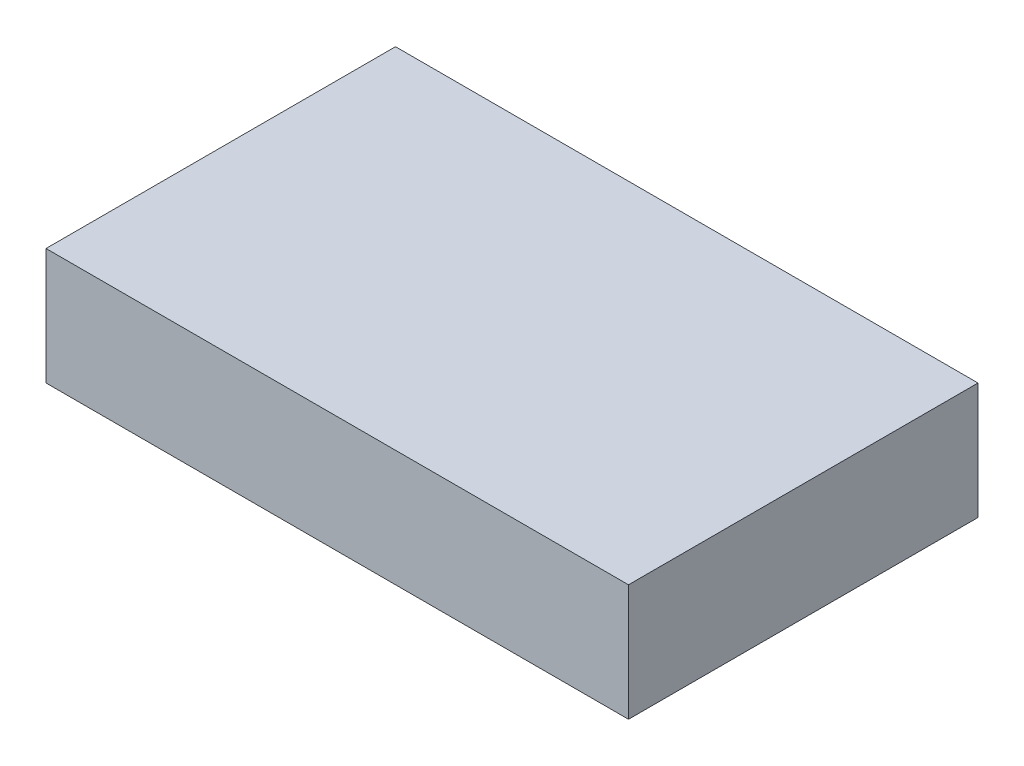
ISO-10303-21;
HEADER;
FILE_DESCRIPTION(('STEP AP214'),'2;1');
FILE_NAME('part.step','',(''),(''),'','','');
FILE_SCHEMA(('AUTOMOTIVE_DESIGN { 1 0 10303 214 1 1 1 1 }'));
ENDSEC;
DATA;
#1=APPLICATION_CONTEXT('core data for automotive mechanical design processes');
#2=APPLICATION_PROTOCOL_DEFINITION('international standard','automotive_design',2000,#1);
#3=PRODUCT_CONTEXT('',#1,'mechanical');
#4=PRODUCT('Part','Part','',(#3));
#5=PRODUCT_RELATED_PRODUCT_CATEGORY('part','',(#4));
#6=PRODUCT_DEFINITION_FORMATION('','',#4);
#7=PRODUCT_DEFINITION_CONTEXT('part definition',#1,'design');
#8=PRODUCT_DEFINITION('design','',#6,#7);
#9=PRODUCT_DEFINITION_SHAPE('','',#8);
#10=(LENGTH_UNIT() NAMED_UNIT(*) SI_UNIT(.MILLI.,.METRE.));
#11=(NAMED_UNIT(*) PLANE_ANGLE_UNIT() SI_UNIT($,.RADIAN.));
#12=(NAMED_UNIT(*) SI_UNIT($,.STERADIAN.) SOLID_ANGLE_UNIT());
#13=UNCERTAINTY_MEASURE_WITH_UNIT(LENGTH_MEASURE(1.E-05),#10,'distance_accuracy_value','');
#14=(GEOMETRIC_REPRESENTATION_CONTEXT(3) GLOBAL_UNCERTAINTY_ASSIGNED_CONTEXT((#13)) GLOBAL_UNIT_ASSIGNED_CONTEXT((#10,
#11,#12)) REPRESENTATION_CONTEXT('',''));
#15=CARTESIAN_POINT('',(0.,0.,0.));
#16=DIRECTION('',(0.,0.,1.));
#17=DIRECTION('',(1.,0.,0.));
#18=AXIS2_PLACEMENT_3D('',#15,#16,#17);
#19=CARTESIAN_POINT('',(-3276.44153160715,1000.,-1169.11764705882));
#20=DIRECTION('',(1.,0.,0.));
#21=DIRECTION('',(0.,0.,-1.));
#22=AXIS2_PLACEMENT_3D('',#19,#20,#21);
#23=PLANE('',#22);
#24=DIRECTION('',(0.,0.,1.));
#25=VECTOR('',#24,1.);
#26=CARTESIAN_POINT('',(-3276.44153160715,0.,-1169.11764705882));
#27=LINE('',#26,#25);
#28=CARTESIAN_POINT('',(-3276.44153160715,0.,-1169.11764705882));
#29=VERTEX_POINT('',#28);
#30=CARTESIAN_POINT('',(-3276.44153160715,0.,1830.88235294118));
#31=VERTEX_POINT('',#30);
#32=EDGE_CURVE('E107',#29,#31,#27,.T.);
#33=ORIENTED_EDGE('',*,*,#32,.T.);
#34=DIRECTION('',(0.,-1.,0.));
#35=VECTOR('',#34,1.);
#36=CARTESIAN_POINT('',(-3276.44153160715,1000.,1830.88235294118));
#37=LINE('',#36,#35);
#38=CARTESIAN_POINT('',(-3276.44153160715,1000.,1830.88235294118));
#39=VERTEX_POINT('',#38);
#40=EDGE_CURVE('E11',#39,#31,#37,.T.);
#41=ORIENTED_EDGE('',*,*,#40,.F.);
#42=DIRECTION('',(0.,0.,1.));
#43=VECTOR('',#42,1.);
#44=CARTESIAN_POINT('',(-3276.44153160715,1000.,-1169.11764705882));
#45=LINE('',#44,#43);
#46=CARTESIAN_POINT('',(-3276.44153160715,1000.,-1169.11764705882));
#47=VERTEX_POINT('',#46);
#48=EDGE_CURVE('E91',#47,#39,#45,.T.);
#49=ORIENTED_EDGE('',*,*,#48,.F.);
#50=DIRECTION('',(0.,-1.,0.));
#51=VECTOR('',#50,1.);
#52=CARTESIAN_POINT('',(-3276.44153160715,1000.,-1169.11764705882));
#53=LINE('',#52,#51);
#54=EDGE_CURVE('E103',#47,#29,#53,.T.);
#55=ORIENTED_EDGE('',*,*,#54,.T.);
#56=EDGE_LOOP('',(#33,#41,#49,#55));
#57=FACE_BOUND('',#56,.T.);
#58=ADVANCED_FACE('F39',(#57),#23,.F.);
#59=CARTESIAN_POINT('',(-3276.44153160715,1000.,1830.88235294118));
#60=DIRECTION('',(0.,0.,-1.));
#61=DIRECTION('',(-1.,0.,0.));
#62=AXIS2_PLACEMENT_3D('',#59,#60,#61);
#63=PLANE('',#62);
#64=DIRECTION('',(1.,0.,0.));
#65=VECTOR('',#64,1.);
#66=CARTESIAN_POINT('',(-3276.44153160715,0.,1830.88235294118));
#67=LINE('',#66,#65);
#68=CARTESIAN_POINT('',(1723.55846839285,0.,1830.88235294118));
#69=VERTEX_POINT('',#68);
#70=EDGE_CURVE('E96',#31,#69,#67,.T.);
#71=ORIENTED_EDGE('',*,*,#70,.T.);
#72=DIRECTION('',(0.,-1.,0.));
#73=VECTOR('',#72,1.);
#74=CARTESIAN_POINT('',(1723.55846839285,1000.,1830.88235294118));
#75=LINE('',#74,#73);
#76=CARTESIAN_POINT('',(1723.55846839285,1000.,1830.88235294118));
#77=VERTEX_POINT('',#76);
#78=EDGE_CURVE('E48',#77,#69,#75,.T.);
#79=ORIENTED_EDGE('',*,*,#78,.F.);
#80=DIRECTION('',(1.,0.,0.));
#81=VECTOR('',#80,1.);
#82=CARTESIAN_POINT('',(-3276.44153160715,1000.,1830.88235294118));
#83=LINE('',#82,#81);
#84=EDGE_CURVE('E86',#39,#77,#83,.T.);
#85=ORIENTED_EDGE('',*,*,#84,.F.);
#86=ORIENTED_EDGE('',*,*,#40,.T.);
#87=EDGE_LOOP('',(#71,#79,#85,#86));
#88=FACE_BOUND('',#87,.T.);
#89=ADVANCED_FACE('F95',(#88),#63,.F.);
#90=CARTESIAN_POINT('',(1723.55846839285,1000.,-1169.11764705882));
#91=DIRECTION('',(-1.,0.,0.));
#92=DIRECTION('',(0.,0.,1.));
#93=AXIS2_PLACEMENT_3D('',#90,#91,#92);
#94=PLANE('',#93);
#95=DIRECTION('',(0.,0.,-1.));
#96=VECTOR('',#95,1.);
#97=CARTESIAN_POINT('',(1723.55846839285,0.,-1169.11764705882));
#98=LINE('',#97,#96);
#99=CARTESIAN_POINT('',(1723.55846839285,0.,-1169.11764705882));
#100=VERTEX_POINT('',#99);
#101=EDGE_CURVE('E73',#69,#100,#98,.T.);
#102=ORIENTED_EDGE('',*,*,#101,.T.);
#103=DIRECTION('',(0.,-1.,0.));
#104=VECTOR('',#103,1.);
#105=CARTESIAN_POINT('',(1723.55846839285,1000.,-1169.11764705882));
#106=LINE('',#105,#104);
#107=CARTESIAN_POINT('',(1723.55846839285,1000.,-1169.11764705882));
#108=VERTEX_POINT('',#107);
#109=EDGE_CURVE('E98',#108,#100,#106,.T.);
#110=ORIENTED_EDGE('',*,*,#109,.F.);
#111=DIRECTION('',(0.,0.,-1.));
#112=VECTOR('',#111,1.);
#113=CARTESIAN_POINT('',(1723.55846839285,1000.,-1169.11764705882));
#114=LINE('',#113,#112);
#115=EDGE_CURVE('E89',#77,#108,#114,.T.);
#116=ORIENTED_EDGE('',*,*,#115,.F.);
#117=ORIENTED_EDGE('',*,*,#78,.T.);
#118=EDGE_LOOP('',(#102,#110,#116,#117));
#119=FACE_BOUND('',#118,.T.);
#120=ADVANCED_FACE('F99',(#119),#94,.F.);
#121=CARTESIAN_POINT('',(-3276.44153160715,1000.,-1169.11764705882));
#122=DIRECTION('',(0.,0.,1.));
#123=DIRECTION('',(1.,0.,0.));
#124=AXIS2_PLACEMENT_3D('',#121,#122,#123);
#125=PLANE('',#124);
#126=DIRECTION('',(-1.,0.,0.));
#127=VECTOR('',#126,1.);
#128=CARTESIAN_POINT('',(-3276.44153160715,0.,-1169.11764705882));
#129=LINE('',#128,#127);
#130=EDGE_CURVE('E79',#100,#29,#129,.T.);
#131=ORIENTED_EDGE('',*,*,#130,.T.);
#132=ORIENTED_EDGE('',*,*,#54,.F.);
#133=DIRECTION('',(-1.,0.,0.));
#134=VECTOR('',#133,1.);
#135=CARTESIAN_POINT('',(-3276.44153160715,1000.,-1169.11764705882));
#136=LINE('',#135,#134);
#137=EDGE_CURVE('E56',#108,#47,#136,.T.);
#138=ORIENTED_EDGE('',*,*,#137,.F.);
#139=ORIENTED_EDGE('',*,*,#109,.T.);
#140=EDGE_LOOP('',(#131,#132,#138,#139));
#141=FACE_BOUND('',#140,.T.);
#142=ADVANCED_FACE('F120',(#141),#125,.F.);
#143=CARTESIAN_POINT('',(0.,1000.,0.));
#144=DIRECTION('',(0.,1.,0.));
#145=DIRECTION('',(0.,0.,1.));
#146=AXIS2_PLACEMENT_3D('',#143,#144,#145);
#147=PLANE('',#146);
#148=ORIENTED_EDGE('',*,*,#48,.T.);
#149=ORIENTED_EDGE('',*,*,#84,.T.);
#150=ORIENTED_EDGE('',*,*,#115,.T.);
#151=ORIENTED_EDGE('',*,*,#137,.T.);
#152=EDGE_LOOP('',(#148,#149,#150,#151));
#153=FACE_BOUND('',#152,.T.);
#154=ADVANCED_FACE('F87',(#153),#147,.T.);
#155=CARTESIAN_POINT('',(0.,0.,0.));
#156=DIRECTION('',(0.,1.,0.));
#157=DIRECTION('',(0.,0.,1.));
#158=AXIS2_PLACEMENT_3D('',#155,#156,#157);
#159=PLANE('',#158);
#160=ORIENTED_EDGE('',*,*,#32,.F.);
#161=ORIENTED_EDGE('',*,*,#130,.F.);
#162=ORIENTED_EDGE('',*,*,#101,.F.);
#163=ORIENTED_EDGE('',*,*,#70,.F.);
#164=EDGE_LOOP('',(#160,#161,#162,#163));
#165=FACE_BOUND('',#164,.T.);
#166=ADVANCED_FACE('F123',(#165),#159,.F.);
#167=CLOSED_SHELL('',(#58,#89,#120,#142,#154,#166));
#168=MANIFOLD_SOLID_BREP('B2',#167);
#169=ADVANCED_BREP_SHAPE_REPRESENTATION('',(#18,#168),#14);
#170=SHAPE_DEFINITION_REPRESENTATION(#9,#169);
ENDSEC;
END-ISO-10303-21;
